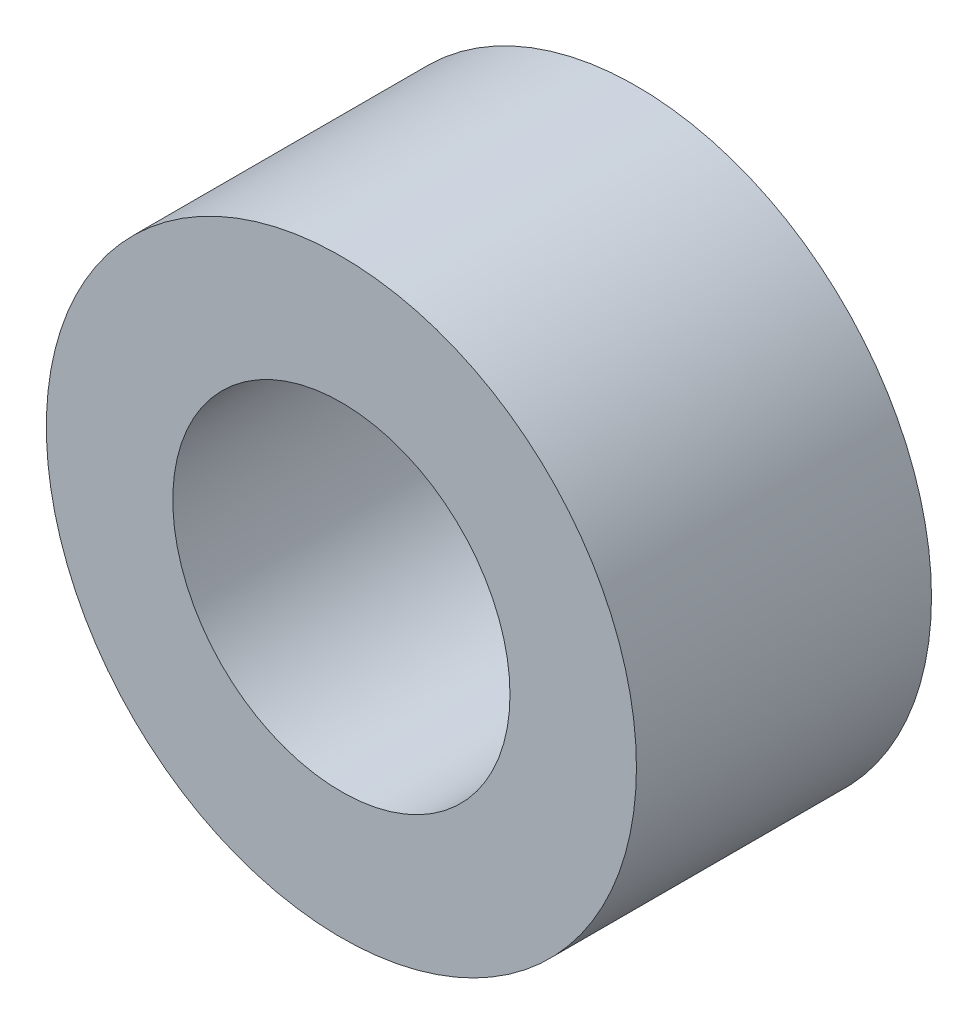
ISO-10303-21;
HEADER;
FILE_DESCRIPTION(('STEP AP214'),'2;1');
FILE_NAME('part.step','',(''),(''),'','','');
FILE_SCHEMA(('AUTOMOTIVE_DESIGN { 1 0 10303 214 1 1 1 1 }'));
ENDSEC;
DATA;
#1=APPLICATION_CONTEXT('core data for automotive mechanical design processes');
#2=APPLICATION_PROTOCOL_DEFINITION('international standard','automotive_design',2000,#1);
#3=PRODUCT_CONTEXT('',#1,'mechanical');
#4=PRODUCT('Part','Part','',(#3));
#5=PRODUCT_RELATED_PRODUCT_CATEGORY('part','',(#4));
#6=PRODUCT_DEFINITION_FORMATION('','',#4);
#7=PRODUCT_DEFINITION_CONTEXT('part definition',#1,'design');
#8=PRODUCT_DEFINITION('design','',#6,#7);
#9=PRODUCT_DEFINITION_SHAPE('','',#8);
#10=(LENGTH_UNIT() NAMED_UNIT(*) SI_UNIT(.MILLI.,.METRE.));
#11=(NAMED_UNIT(*) PLANE_ANGLE_UNIT() SI_UNIT($,.RADIAN.));
#12=(NAMED_UNIT(*) SI_UNIT($,.STERADIAN.) SOLID_ANGLE_UNIT());
#13=UNCERTAINTY_MEASURE_WITH_UNIT(LENGTH_MEASURE(1.E-05),#10,'distance_accuracy_value','');
#14=(GEOMETRIC_REPRESENTATION_CONTEXT(3) GLOBAL_UNCERTAINTY_ASSIGNED_CONTEXT((#13)) GLOBAL_UNIT_ASSIGNED_CONTEXT((#10,
#11,#12)) REPRESENTATION_CONTEXT('',''));
#15=CARTESIAN_POINT('',(0.,0.,0.));
#16=DIRECTION('',(0.,0.,1.));
#17=DIRECTION('',(1.,0.,0.));
#18=AXIS2_PLACEMENT_3D('',#15,#16,#17);
#19=CARTESIAN_POINT('',(0.,0.,7.));
#20=DIRECTION('',(0.,0.,1.));
#21=DIRECTION('',(1.,0.,0.));
#22=AXIS2_PLACEMENT_3D('',#19,#20,#21);
#23=PLANE('',#22);
#24=CARTESIAN_POINT('',(0.,0.,7.));
#25=DIRECTION('',(0.,0.,1.));
#26=DIRECTION('',(1.,0.,0.));
#27=AXIS2_PLACEMENT_3D('',#24,#25,#26);
#28=CIRCLE('',#27,7.);
#29=CARTESIAN_POINT('',(7.,0.,7.));
#30=VERTEX_POINT('',#29);
#31=EDGE_CURVE('E10',#30,#30,#28,.T.);
#32=ORIENTED_EDGE('',*,*,#31,.T.);
#33=EDGE_LOOP('',(#32));
#34=FACE_BOUND('',#33,.T.);
#35=CARTESIAN_POINT('',(0.,0.,7.));
#36=DIRECTION('',(0.,0.,1.));
#37=DIRECTION('',(1.,0.,0.));
#38=AXIS2_PLACEMENT_3D('',#35,#36,#37);
#39=CIRCLE('',#38,4.);
#40=CARTESIAN_POINT('',(4.,0.,7.));
#41=VERTEX_POINT('',#40);
#42=EDGE_CURVE('E46',#41,#41,#39,.T.);
#43=ORIENTED_EDGE('',*,*,#42,.F.);
#44=EDGE_LOOP('',(#43));
#45=FACE_BOUND('',#44,.T.);
#46=ADVANCED_FACE('F35',(#34,#45),#23,.T.);
#47=CARTESIAN_POINT('',(0.,0.,0.));
#48=DIRECTION('',(0.,0.,1.));
#49=DIRECTION('',(1.,0.,0.));
#50=AXIS2_PLACEMENT_3D('',#47,#48,#49);
#51=PLANE('',#50);
#52=CARTESIAN_POINT('',(0.,0.,0.));
#53=DIRECTION('',(0.,0.,1.));
#54=DIRECTION('',(1.,0.,0.));
#55=AXIS2_PLACEMENT_3D('',#52,#53,#54);
#56=CIRCLE('',#55,7.);
#57=CARTESIAN_POINT('',(7.,0.,0.));
#58=VERTEX_POINT('',#57);
#59=EDGE_CURVE('E39',#58,#58,#56,.T.);
#60=ORIENTED_EDGE('',*,*,#59,.F.);
#61=EDGE_LOOP('',(#60));
#62=FACE_BOUND('',#61,.T.);
#63=CARTESIAN_POINT('',(0.,0.,0.));
#64=DIRECTION('',(0.,0.,1.));
#65=DIRECTION('',(1.,0.,0.));
#66=AXIS2_PLACEMENT_3D('',#63,#64,#65);
#67=CIRCLE('',#66,4.);
#68=CARTESIAN_POINT('',(4.,0.,0.));
#69=VERTEX_POINT('',#68);
#70=EDGE_CURVE('E48',#69,#69,#67,.T.);
#71=ORIENTED_EDGE('',*,*,#70,.T.);
#72=EDGE_LOOP('',(#71));
#73=FACE_BOUND('',#72,.T.);
#74=ADVANCED_FACE('F58',(#62,#73),#51,.F.);
#75=CARTESIAN_POINT('',(0.,0.,7.));
#76=DIRECTION('',(0.,0.,-1.));
#77=DIRECTION('',(-1.,0.,0.));
#78=AXIS2_PLACEMENT_3D('',#75,#76,#77);
#79=CYLINDRICAL_SURFACE('',#78,7.);
#80=ORIENTED_EDGE('',*,*,#31,.F.);
#81=EDGE_LOOP('',(#80));
#82=FACE_BOUND('',#81,.T.);
#83=ORIENTED_EDGE('',*,*,#59,.T.);
#84=EDGE_LOOP('',(#83));
#85=FACE_BOUND('',#84,.T.);
#86=ADVANCED_FACE('F37',(#82,#85),#79,.T.);
#87=CARTESIAN_POINT('',(0.,0.,7.));
#88=DIRECTION('',(0.,0.,-1.));
#89=DIRECTION('',(-1.,0.,0.));
#90=AXIS2_PLACEMENT_3D('',#87,#88,#89);
#91=CYLINDRICAL_SURFACE('',#90,4.);
#92=ORIENTED_EDGE('',*,*,#42,.T.);
#93=EDGE_LOOP('',(#92));
#94=FACE_BOUND('',#93,.T.);
#95=ORIENTED_EDGE('',*,*,#70,.F.);
#96=EDGE_LOOP('',(#95));
#97=FACE_BOUND('',#96,.T.);
#98=ADVANCED_FACE('F54',(#94,#97),#91,.F.);
#99=CLOSED_SHELL('',(#46,#74,#86,#98));
#100=MANIFOLD_SOLID_BREP('B2',#99);
#101=ADVANCED_BREP_SHAPE_REPRESENTATION('',(#18,#100),#14);
#102=SHAPE_DEFINITION_REPRESENTATION(#9,#101);
ENDSEC;
END-ISO-10303-21;
